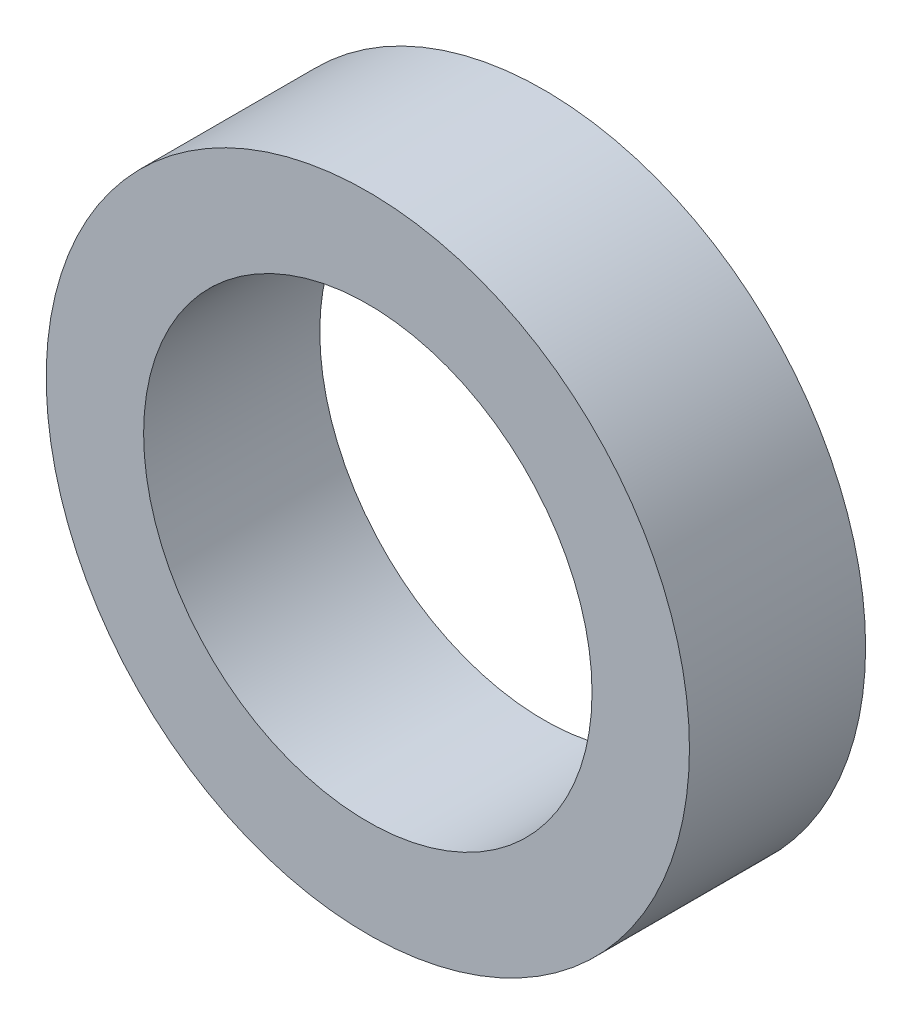
ISO-10303-21;
HEADER;
FILE_DESCRIPTION(('STEP AP214'),'2;1');
FILE_NAME('part.step','',(''),(''),'','','');
FILE_SCHEMA(('AUTOMOTIVE_DESIGN { 1 0 10303 214 1 1 1 1 }'));
ENDSEC;
DATA;
#1=APPLICATION_CONTEXT('core data for automotive mechanical design processes');
#2=APPLICATION_PROTOCOL_DEFINITION('international standard','automotive_design',2000,#1);
#3=PRODUCT_CONTEXT('',#1,'mechanical');
#4=PRODUCT('Part','Part','',(#3));
#5=PRODUCT_RELATED_PRODUCT_CATEGORY('part','',(#4));
#6=PRODUCT_DEFINITION_FORMATION('','',#4);
#7=PRODUCT_DEFINITION_CONTEXT('part definition',#1,'design');
#8=PRODUCT_DEFINITION('design','',#6,#7);
#9=PRODUCT_DEFINITION_SHAPE('','',#8);
#10=(LENGTH_UNIT() NAMED_UNIT(*) SI_UNIT(.MILLI.,.METRE.));
#11=(NAMED_UNIT(*) PLANE_ANGLE_UNIT() SI_UNIT($,.RADIAN.));
#12=(NAMED_UNIT(*) SI_UNIT($,.STERADIAN.) SOLID_ANGLE_UNIT());
#13=UNCERTAINTY_MEASURE_WITH_UNIT(LENGTH_MEASURE(1.E-05),#10,'distance_accuracy_value','');
#14=(GEOMETRIC_REPRESENTATION_CONTEXT(3) GLOBAL_UNCERTAINTY_ASSIGNED_CONTEXT((#13)) GLOBAL_UNIT_ASSIGNED_CONTEXT((#10,
#11,#12)) REPRESENTATION_CONTEXT('',''));
#15=CARTESIAN_POINT('',(0.,0.,0.));
#16=DIRECTION('',(0.,0.,1.));
#17=DIRECTION('',(1.,0.,0.));
#18=AXIS2_PLACEMENT_3D('',#15,#16,#17);
#19=CARTESIAN_POINT('',(0.,0.,2.75));
#20=DIRECTION('',(0.,0.,-1.));
#21=DIRECTION('',(-1.,0.,0.));
#22=AXIS2_PLACEMENT_3D('',#19,#20,#21);
#23=CYLINDRICAL_SURFACE('',#22,3.5);
#24=CARTESIAN_POINT('',(0.,0.,0.));
#25=DIRECTION('',(0.,0.,-1.));
#26=DIRECTION('',(-1.,0.,0.));
#27=AXIS2_PLACEMENT_3D('',#24,#25,#26);
#28=CIRCLE('',#27,3.5);
#29=CARTESIAN_POINT('',(-3.5,0.,0.));
#30=VERTEX_POINT('',#29);
#31=EDGE_CURVE('E17',#30,#30,#28,.T.);
#32=ORIENTED_EDGE('',*,*,#31,.T.);
#33=EDGE_LOOP('',(#32));
#34=FACE_BOUND('',#33,.T.);
#35=CARTESIAN_POINT('',(0.,0.,2.75));
#36=DIRECTION('',(0.,0.,-1.));
#37=DIRECTION('',(-1.,0.,0.));
#38=AXIS2_PLACEMENT_3D('',#35,#36,#37);
#39=CIRCLE('',#38,3.5);
#40=CARTESIAN_POINT('',(-3.5,0.,2.75));
#41=VERTEX_POINT('',#40);
#42=EDGE_CURVE('E30',#41,#41,#39,.T.);
#43=ORIENTED_EDGE('',*,*,#42,.F.);
#44=EDGE_LOOP('',(#43));
#45=FACE_BOUND('',#44,.T.);
#46=ADVANCED_FACE('F14',(#34,#45),#23,.F.);
#47=CARTESIAN_POINT('',(0.,0.,0.));
#48=DIRECTION('',(0.,0.,1.));
#49=DIRECTION('',(1.,0.,0.));
#50=AXIS2_PLACEMENT_3D('',#47,#48,#49);
#51=PLANE('',#50);
#52=ORIENTED_EDGE('',*,*,#31,.F.);
#53=EDGE_LOOP('',(#52));
#54=FACE_BOUND('',#53,.T.);
#55=CARTESIAN_POINT('',(0.,0.,0.));
#56=DIRECTION('',(0.,0.,1.));
#57=DIRECTION('',(1.,0.,0.));
#58=AXIS2_PLACEMENT_3D('',#55,#56,#57);
#59=CIRCLE('',#58,5.02064365808005);
#60=CARTESIAN_POINT('',(5.02064365808005,0.,0.));
#61=VERTEX_POINT('',#60);
#62=EDGE_CURVE('E22',#61,#61,#59,.T.);
#63=ORIENTED_EDGE('',*,*,#62,.F.);
#64=EDGE_LOOP('',(#63));
#65=FACE_BOUND('',#64,.T.);
#66=ADVANCED_FACE('F41',(#54,#65),#51,.F.);
#67=CARTESIAN_POINT('',(0.,0.,2.75));
#68=DIRECTION('',(0.,0.,1.));
#69=DIRECTION('',(1.,0.,0.));
#70=AXIS2_PLACEMENT_3D('',#67,#68,#69);
#71=PLANE('',#70);
#72=ORIENTED_EDGE('',*,*,#42,.T.);
#73=EDGE_LOOP('',(#72));
#74=FACE_BOUND('',#73,.T.);
#75=CARTESIAN_POINT('',(0.,0.,2.75));
#76=DIRECTION('',(0.,0.,1.));
#77=DIRECTION('',(1.,0.,0.));
#78=AXIS2_PLACEMENT_3D('',#75,#76,#77);
#79=CIRCLE('',#78,5.02064365808005);
#80=CARTESIAN_POINT('',(5.02064365808005,0.,2.75));
#81=VERTEX_POINT('',#80);
#82=EDGE_CURVE('E10',#81,#81,#79,.F.);
#83=ORIENTED_EDGE('',*,*,#82,.F.);
#84=EDGE_LOOP('',(#83));
#85=FACE_BOUND('',#84,.T.);
#86=ADVANCED_FACE('F44',(#74,#85),#71,.T.);
#87=CARTESIAN_POINT('',(0.,0.,-14.2005247061986));
#88=DIRECTION('',(0.,0.,1.));
#89=DIRECTION('',(1.,0.,0.));
#90=AXIS2_PLACEMENT_3D('',#87,#88,#89);
#91=CYLINDRICAL_SURFACE('',#90,5.02064365808005);
#92=ORIENTED_EDGE('',*,*,#82,.T.);
#93=EDGE_LOOP('',(#92));
#94=FACE_BOUND('',#93,.T.);
#95=ORIENTED_EDGE('',*,*,#62,.T.);
#96=EDGE_LOOP('',(#95));
#97=FACE_BOUND('',#96,.T.);
#98=ADVANCED_FACE('F47',(#94,#97),#91,.T.);
#99=CLOSED_SHELL('',(#46,#66,#86,#98));
#100=MANIFOLD_SOLID_BREP('B1',#99);
#101=ADVANCED_BREP_SHAPE_REPRESENTATION('',(#18,#100),#14);
#102=SHAPE_DEFINITION_REPRESENTATION(#9,#101);
ENDSEC;
END-ISO-10303-21;
